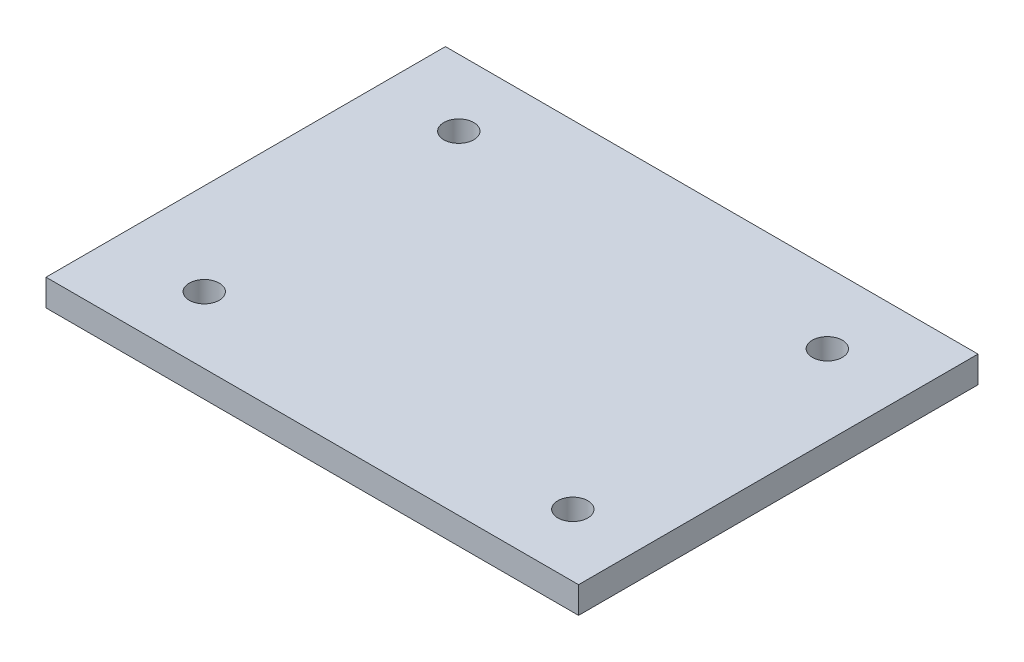
ISO-10303-21;
HEADER;
FILE_DESCRIPTION(('STEP AP214'),'2;1');
FILE_NAME('part.step','',(''),(''),'','','');
FILE_SCHEMA(('AUTOMOTIVE_DESIGN { 1 0 10303 214 1 1 1 1 }'));
ENDSEC;
DATA;
#1=APPLICATION_CONTEXT('core data for automotive mechanical design processes');
#2=APPLICATION_PROTOCOL_DEFINITION('international standard','automotive_design',2000,#1);
#3=PRODUCT_CONTEXT('',#1,'mechanical');
#4=PRODUCT('Part','Part','',(#3));
#5=PRODUCT_RELATED_PRODUCT_CATEGORY('part','',(#4));
#6=PRODUCT_DEFINITION_FORMATION('','',#4);
#7=PRODUCT_DEFINITION_CONTEXT('part definition',#1,'design');
#8=PRODUCT_DEFINITION('design','',#6,#7);
#9=PRODUCT_DEFINITION_SHAPE('','',#8);
#10=(LENGTH_UNIT() NAMED_UNIT(*) SI_UNIT(.MILLI.,.METRE.));
#11=(NAMED_UNIT(*) PLANE_ANGLE_UNIT() SI_UNIT($,.RADIAN.));
#12=(NAMED_UNIT(*) SI_UNIT($,.STERADIAN.) SOLID_ANGLE_UNIT());
#13=UNCERTAINTY_MEASURE_WITH_UNIT(LENGTH_MEASURE(1.E-05),#10,'distance_accuracy_value','');
#14=(GEOMETRIC_REPRESENTATION_CONTEXT(3) GLOBAL_UNCERTAINTY_ASSIGNED_CONTEXT((#13)) GLOBAL_UNIT_ASSIGNED_CONTEXT((#10,
#11,#12)) REPRESENTATION_CONTEXT('',''));
#15=CARTESIAN_POINT('',(0.,0.,0.));
#16=DIRECTION('',(0.,0.,1.));
#17=DIRECTION('',(1.,0.,0.));
#18=AXIS2_PLACEMENT_3D('',#15,#16,#17);
#19=CARTESIAN_POINT('',(0.,4.,0.));
#20=DIRECTION('',(1.,0.,0.));
#21=DIRECTION('',(0.,0.,-1.));
#22=AXIS2_PLACEMENT_3D('',#19,#20,#21);
#23=PLANE('',#22);
#24=DIRECTION('',(0.,0.,1.));
#25=VECTOR('',#24,1.);
#26=CARTESIAN_POINT('',(0.,0.,0.));
#27=LINE('',#26,#25);
#28=CARTESIAN_POINT('',(0.,0.,0.));
#29=VERTEX_POINT('',#28);
#30=CARTESIAN_POINT('',(0.,0.,60.));
#31=VERTEX_POINT('',#30);
#32=EDGE_CURVE('E105',#29,#31,#27,.T.);
#33=ORIENTED_EDGE('',*,*,#32,.T.);
#34=DIRECTION('',(0.,-1.,0.));
#35=VECTOR('',#34,1.);
#36=CARTESIAN_POINT('',(0.,4.,60.));
#37=LINE('',#36,#35);
#38=CARTESIAN_POINT('',(0.,4.,60.));
#39=VERTEX_POINT('',#38);
#40=EDGE_CURVE('E11',#39,#31,#37,.T.);
#41=ORIENTED_EDGE('',*,*,#40,.F.);
#42=DIRECTION('',(0.,0.,1.));
#43=VECTOR('',#42,1.);
#44=CARTESIAN_POINT('',(0.,4.,0.));
#45=LINE('',#44,#43);
#46=CARTESIAN_POINT('',(0.,4.,0.));
#47=VERTEX_POINT('',#46);
#48=EDGE_CURVE('E89',#47,#39,#45,.T.);
#49=ORIENTED_EDGE('',*,*,#48,.F.);
#50=DIRECTION('',(0.,-1.,0.));
#51=VECTOR('',#50,1.);
#52=CARTESIAN_POINT('',(0.,4.,0.));
#53=LINE('',#52,#51);
#54=EDGE_CURVE('E98',#47,#29,#53,.T.);
#55=ORIENTED_EDGE('',*,*,#54,.T.);
#56=EDGE_LOOP('',(#33,#41,#49,#55));
#57=FACE_BOUND('',#56,.T.);
#58=ADVANCED_FACE('F39',(#57),#23,.F.);
#59=CARTESIAN_POINT('',(0.,4.,60.));
#60=DIRECTION('',(0.,0.,-1.));
#61=DIRECTION('',(-1.,0.,0.));
#62=AXIS2_PLACEMENT_3D('',#59,#60,#61);
#63=PLANE('',#62);
#64=DIRECTION('',(1.,0.,0.));
#65=VECTOR('',#64,1.);
#66=CARTESIAN_POINT('',(0.,0.,60.));
#67=LINE('',#66,#65);
#68=CARTESIAN_POINT('',(80.,0.,60.));
#69=VERTEX_POINT('',#68);
#70=EDGE_CURVE('E94',#31,#69,#67,.T.);
#71=ORIENTED_EDGE('',*,*,#70,.T.);
#72=DIRECTION('',(0.,-1.,0.));
#73=VECTOR('',#72,1.);
#74=CARTESIAN_POINT('',(80.,4.,60.));
#75=LINE('',#74,#73);
#76=CARTESIAN_POINT('',(80.,4.,60.));
#77=VERTEX_POINT('',#76);
#78=EDGE_CURVE('E50',#77,#69,#75,.T.);
#79=ORIENTED_EDGE('',*,*,#78,.F.);
#80=DIRECTION('',(1.,0.,0.));
#81=VECTOR('',#80,1.);
#82=CARTESIAN_POINT('',(0.,4.,60.));
#83=LINE('',#82,#81);
#84=EDGE_CURVE('E85',#39,#77,#83,.T.);
#85=ORIENTED_EDGE('',*,*,#84,.F.);
#86=ORIENTED_EDGE('',*,*,#40,.T.);
#87=EDGE_LOOP('',(#71,#79,#85,#86));
#88=FACE_BOUND('',#87,.T.);
#89=ADVANCED_FACE('F91',(#88),#63,.F.);
#90=CARTESIAN_POINT('',(80.,4.,0.));
#91=DIRECTION('',(-1.,0.,0.));
#92=DIRECTION('',(0.,0.,1.));
#93=AXIS2_PLACEMENT_3D('',#90,#91,#92);
#94=PLANE('',#93);
#95=DIRECTION('',(0.,0.,-1.));
#96=VECTOR('',#95,1.);
#97=CARTESIAN_POINT('',(80.,0.,0.));
#98=LINE('',#97,#96);
#99=CARTESIAN_POINT('',(80.,0.,0.));
#100=VERTEX_POINT('',#99);
#101=EDGE_CURVE('E75',#69,#100,#98,.T.);
#102=ORIENTED_EDGE('',*,*,#101,.T.);
#103=DIRECTION('',(0.,-1.,0.));
#104=VECTOR('',#103,1.);
#105=CARTESIAN_POINT('',(80.,4.,0.));
#106=LINE('',#105,#104);
#107=CARTESIAN_POINT('',(80.,4.,0.));
#108=VERTEX_POINT('',#107);
#109=EDGE_CURVE('E92',#108,#100,#106,.T.);
#110=ORIENTED_EDGE('',*,*,#109,.F.);
#111=DIRECTION('',(0.,0.,-1.));
#112=VECTOR('',#111,1.);
#113=CARTESIAN_POINT('',(80.,4.,0.));
#114=LINE('',#113,#112);
#115=EDGE_CURVE('E86',#77,#108,#114,.T.);
#116=ORIENTED_EDGE('',*,*,#115,.F.);
#117=ORIENTED_EDGE('',*,*,#78,.T.);
#118=EDGE_LOOP('',(#102,#110,#116,#117));
#119=FACE_BOUND('',#118,.T.);
#120=ADVANCED_FACE('F96',(#119),#94,.F.);
#121=CARTESIAN_POINT('',(0.,4.,0.));
#122=DIRECTION('',(0.,0.,1.));
#123=DIRECTION('',(1.,0.,0.));
#124=AXIS2_PLACEMENT_3D('',#121,#122,#123);
#125=PLANE('',#124);
#126=DIRECTION('',(-1.,0.,0.));
#127=VECTOR('',#126,1.);
#128=CARTESIAN_POINT('',(0.,0.,0.));
#129=LINE('',#128,#127);
#130=EDGE_CURVE('E79',#100,#29,#129,.T.);
#131=ORIENTED_EDGE('',*,*,#130,.T.);
#132=ORIENTED_EDGE('',*,*,#54,.F.);
#133=DIRECTION('',(-1.,0.,0.));
#134=VECTOR('',#133,1.);
#135=CARTESIAN_POINT('',(0.,4.,0.));
#136=LINE('',#135,#134);
#137=EDGE_CURVE('E54',#108,#47,#136,.T.);
#138=ORIENTED_EDGE('',*,*,#137,.F.);
#139=ORIENTED_EDGE('',*,*,#109,.T.);
#140=EDGE_LOOP('',(#131,#132,#138,#139));
#141=FACE_BOUND('',#140,.T.);
#142=ADVANCED_FACE('F109',(#141),#125,.F.);
#143=CARTESIAN_POINT('',(0.,4.,0.));
#144=DIRECTION('',(0.,1.,0.));
#145=DIRECTION('',(0.,0.,1.));
#146=AXIS2_PLACEMENT_3D('',#143,#144,#145);
#147=PLANE('',#146);
#148=CARTESIAN_POINT('',(13.7708429307959,4.,50.));
#149=DIRECTION('',(0.,1.,0.));
#150=DIRECTION('',(0.,0.,1.));
#151=AXIS2_PLACEMENT_3D('',#148,#149,#150);
#152=CIRCLE('',#151,2.25);
#153=CARTESIAN_POINT('',(13.7708429307959,4.,52.25));
#154=VERTEX_POINT('',#153);
#155=EDGE_CURVE('E125',#154,#154,#152,.T.);
#156=ORIENTED_EDGE('',*,*,#155,.F.);
#157=EDGE_LOOP('',(#156));
#158=FACE_BOUND('',#157,.T.);
#159=CARTESIAN_POINT('',(69.7672709723325,4.,50.6324923628085));
#160=DIRECTION('',(0.,1.,0.));
#161=DIRECTION('',(0.,0.,1.));
#162=AXIS2_PLACEMENT_3D('',#159,#160,#161);
#163=CIRCLE('',#162,2.25);
#164=CARTESIAN_POINT('',(69.7672709723325,4.,52.8824923628085));
#165=VERTEX_POINT('',#164);
#166=EDGE_CURVE('E132',#165,#165,#163,.T.);
#167=ORIENTED_EDGE('',*,*,#166,.F.);
#168=EDGE_LOOP('',(#167));
#169=FACE_BOUND('',#168,.T.);
#170=CARTESIAN_POINT('',(68.,4.,10.6324923628085));
#171=DIRECTION('',(0.,1.,0.));
#172=DIRECTION('',(0.,0.,1.));
#173=AXIS2_PLACEMENT_3D('',#170,#171,#172);
#174=CIRCLE('',#173,2.25);
#175=CARTESIAN_POINT('',(68.,4.,12.8824923628085));
#176=VERTEX_POINT('',#175);
#177=EDGE_CURVE('E116',#176,#176,#174,.T.);
#178=ORIENTED_EDGE('',*,*,#177,.F.);
#179=EDGE_LOOP('',(#178));
#180=FACE_BOUND('',#179,.T.);
#181=CARTESIAN_POINT('',(12.0035719584634,4.,10.));
#182=DIRECTION('',(0.,1.,0.));
#183=DIRECTION('',(0.,0.,1.));
#184=AXIS2_PLACEMENT_3D('',#181,#182,#183);
#185=CIRCLE('',#184,2.25);
#186=CARTESIAN_POINT('',(12.0035719584634,4.,12.25));
#187=VERTEX_POINT('',#186);
#188=EDGE_CURVE('E117',#187,#187,#185,.T.);
#189=ORIENTED_EDGE('',*,*,#188,.F.);
#190=EDGE_LOOP('',(#189));
#191=FACE_BOUND('',#190,.T.);
#192=ORIENTED_EDGE('',*,*,#48,.T.);
#193=ORIENTED_EDGE('',*,*,#84,.T.);
#194=ORIENTED_EDGE('',*,*,#115,.T.);
#195=ORIENTED_EDGE('',*,*,#137,.T.);
#196=EDGE_LOOP('',(#192,#193,#194,#195));
#197=FACE_BOUND('',#196,.T.);
#198=ADVANCED_FACE('F88',(#158,#169,#180,#191,#197),#147,.T.);
#199=CARTESIAN_POINT('',(0.,0.,0.));
#200=DIRECTION('',(0.,1.,0.));
#201=DIRECTION('',(0.,0.,1.));
#202=AXIS2_PLACEMENT_3D('',#199,#200,#201);
#203=PLANE('',#202);
#204=CARTESIAN_POINT('',(13.7708429307959,0.,50.));
#205=DIRECTION('',(0.,1.,0.));
#206=DIRECTION('',(0.,0.,1.));
#207=AXIS2_PLACEMENT_3D('',#204,#205,#206);
#208=CIRCLE('',#207,2.25);
#209=CARTESIAN_POINT('',(13.7708429307959,0.,52.25));
#210=VERTEX_POINT('',#209);
#211=EDGE_CURVE('E122',#210,#210,#208,.T.);
#212=ORIENTED_EDGE('',*,*,#211,.T.);
#213=EDGE_LOOP('',(#212));
#214=FACE_BOUND('',#213,.T.);
#215=CARTESIAN_POINT('',(69.7672709723325,0.,50.6324923628085));
#216=DIRECTION('',(0.,1.,0.));
#217=DIRECTION('',(0.,0.,1.));
#218=AXIS2_PLACEMENT_3D('',#215,#216,#217);
#219=CIRCLE('',#218,2.25);
#220=CARTESIAN_POINT('',(69.7672709723325,0.,52.8824923628085));
#221=VERTEX_POINT('',#220);
#222=EDGE_CURVE('E126',#221,#221,#219,.T.);
#223=ORIENTED_EDGE('',*,*,#222,.T.);
#224=EDGE_LOOP('',(#223));
#225=FACE_BOUND('',#224,.T.);
#226=CARTESIAN_POINT('',(68.,0.,10.6324923628085));
#227=DIRECTION('',(0.,1.,0.));
#228=DIRECTION('',(0.,0.,1.));
#229=AXIS2_PLACEMENT_3D('',#226,#227,#228);
#230=CIRCLE('',#229,2.25);
#231=CARTESIAN_POINT('',(68.,0.,12.8824923628085));
#232=VERTEX_POINT('',#231);
#233=EDGE_CURVE('E131',#232,#232,#230,.T.);
#234=ORIENTED_EDGE('',*,*,#233,.T.);
#235=EDGE_LOOP('',(#234));
#236=FACE_BOUND('',#235,.T.);
#237=CARTESIAN_POINT('',(12.0035719584634,0.,10.));
#238=DIRECTION('',(0.,1.,0.));
#239=DIRECTION('',(0.,0.,1.));
#240=AXIS2_PLACEMENT_3D('',#237,#238,#239);
#241=CIRCLE('',#240,2.25);
#242=CARTESIAN_POINT('',(12.0035719584634,0.,12.25));
#243=VERTEX_POINT('',#242);
#244=EDGE_CURVE('E104',#243,#243,#241,.T.);
#245=ORIENTED_EDGE('',*,*,#244,.T.);
#246=EDGE_LOOP('',(#245));
#247=FACE_BOUND('',#246,.T.);
#248=ORIENTED_EDGE('',*,*,#32,.F.);
#249=ORIENTED_EDGE('',*,*,#130,.F.);
#250=ORIENTED_EDGE('',*,*,#101,.F.);
#251=ORIENTED_EDGE('',*,*,#70,.F.);
#252=EDGE_LOOP('',(#248,#249,#250,#251));
#253=FACE_BOUND('',#252,.T.);
#254=ADVANCED_FACE('F114',(#214,#225,#236,#247,#253),#203,.F.);
#255=CARTESIAN_POINT('',(12.0035719584634,0.,10.));
#256=DIRECTION('',(0.,1.,0.));
#257=DIRECTION('',(0.,0.,1.));
#258=AXIS2_PLACEMENT_3D('',#255,#256,#257);
#259=CYLINDRICAL_SURFACE('',#258,2.25);
#260=ORIENTED_EDGE('',*,*,#244,.F.);
#261=EDGE_LOOP('',(#260));
#262=FACE_BOUND('',#261,.T.);
#263=ORIENTED_EDGE('',*,*,#188,.T.);
#264=EDGE_LOOP('',(#263));
#265=FACE_BOUND('',#264,.T.);
#266=ADVANCED_FACE('F146',(#262,#265),#259,.F.);
#267=CARTESIAN_POINT('',(68.,0.,10.6324923628085));
#268=DIRECTION('',(0.,1.,0.));
#269=DIRECTION('',(0.,0.,1.));
#270=AXIS2_PLACEMENT_3D('',#267,#268,#269);
#271=CYLINDRICAL_SURFACE('',#270,2.25);
#272=ORIENTED_EDGE('',*,*,#233,.F.);
#273=EDGE_LOOP('',(#272));
#274=FACE_BOUND('',#273,.T.);
#275=ORIENTED_EDGE('',*,*,#177,.T.);
#276=EDGE_LOOP('',(#275));
#277=FACE_BOUND('',#276,.T.);
#278=ADVANCED_FACE('F140',(#274,#277),#271,.F.);
#279=CARTESIAN_POINT('',(69.7672709723325,0.,50.6324923628085));
#280=DIRECTION('',(0.,1.,0.));
#281=DIRECTION('',(0.,0.,1.));
#282=AXIS2_PLACEMENT_3D('',#279,#280,#281);
#283=CYLINDRICAL_SURFACE('',#282,2.25);
#284=ORIENTED_EDGE('',*,*,#222,.F.);
#285=EDGE_LOOP('',(#284));
#286=FACE_BOUND('',#285,.T.);
#287=ORIENTED_EDGE('',*,*,#166,.T.);
#288=EDGE_LOOP('',(#287));
#289=FACE_BOUND('',#288,.T.);
#290=ADVANCED_FACE('F156',(#286,#289),#283,.F.);
#291=CARTESIAN_POINT('',(13.7708429307959,0.,50.));
#292=DIRECTION('',(0.,1.,0.));
#293=DIRECTION('',(0.,0.,1.));
#294=AXIS2_PLACEMENT_3D('',#291,#292,#293);
#295=CYLINDRICAL_SURFACE('',#294,2.25);
#296=ORIENTED_EDGE('',*,*,#211,.F.);
#297=EDGE_LOOP('',(#296));
#298=FACE_BOUND('',#297,.T.);
#299=ORIENTED_EDGE('',*,*,#155,.T.);
#300=EDGE_LOOP('',(#299));
#301=FACE_BOUND('',#300,.T.);
#302=ADVANCED_FACE('F210',(#298,#301),#295,.F.);
#303=CLOSED_SHELL('',(#58,#89,#120,#142,#198,#254,#266,#278,#290,#302));
#304=MANIFOLD_SOLID_BREP('B2',#303);
#305=ADVANCED_BREP_SHAPE_REPRESENTATION('',(#18,#304),#14);
#306=SHAPE_DEFINITION_REPRESENTATION(#9,#305);
ENDSEC;
END-ISO-10303-21;
